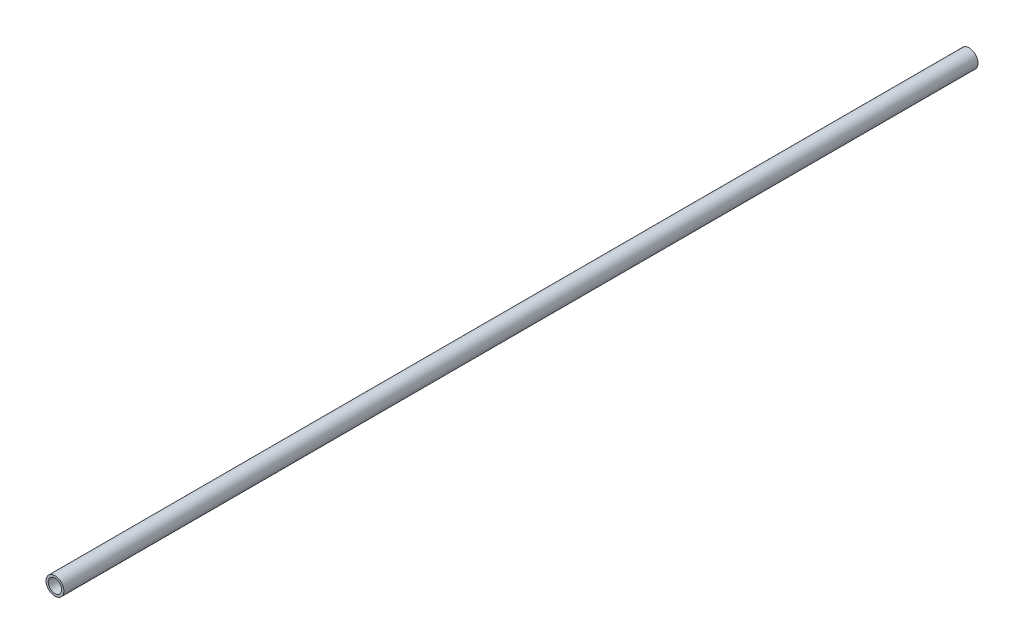
ISO-10303-21;
HEADER;
FILE_DESCRIPTION(('STEP AP214'),'2;1');
FILE_NAME('part.step','',(''),(''),'','','');
FILE_SCHEMA(('AUTOMOTIVE_DESIGN { 1 0 10303 214 1 1 1 1 }'));
ENDSEC;
DATA;
#1=APPLICATION_CONTEXT('core data for automotive mechanical design processes');
#2=APPLICATION_PROTOCOL_DEFINITION('international standard','automotive_design',2000,#1);
#3=PRODUCT_CONTEXT('',#1,'mechanical');
#4=PRODUCT('Part','Part','',(#3));
#5=PRODUCT_RELATED_PRODUCT_CATEGORY('part','',(#4));
#6=PRODUCT_DEFINITION_FORMATION('','',#4);
#7=PRODUCT_DEFINITION_CONTEXT('part definition',#1,'design');
#8=PRODUCT_DEFINITION('design','',#6,#7);
#9=PRODUCT_DEFINITION_SHAPE('','',#8);
#10=(LENGTH_UNIT() NAMED_UNIT(*) SI_UNIT(.MILLI.,.METRE.));
#11=(NAMED_UNIT(*) PLANE_ANGLE_UNIT() SI_UNIT($,.RADIAN.));
#12=(NAMED_UNIT(*) SI_UNIT($,.STERADIAN.) SOLID_ANGLE_UNIT());
#13=UNCERTAINTY_MEASURE_WITH_UNIT(LENGTH_MEASURE(1.E-05),#10,'distance_accuracy_value','');
#14=(GEOMETRIC_REPRESENTATION_CONTEXT(3) GLOBAL_UNCERTAINTY_ASSIGNED_CONTEXT((#13)) GLOBAL_UNIT_ASSIGNED_CONTEXT((#10,
#11,#12)) REPRESENTATION_CONTEXT('',''));
#15=CARTESIAN_POINT('',(0.,0.,0.));
#16=DIRECTION('',(0.,0.,1.));
#17=DIRECTION('',(1.,0.,0.));
#18=AXIS2_PLACEMENT_3D('',#15,#16,#17);
#19=CARTESIAN_POINT('',(0.753770008918936,0.,205.));
#20=DIRECTION('',(0.,0.,1.));
#21=DIRECTION('',(1.,0.,0.));
#22=AXIS2_PLACEMENT_3D('',#19,#20,#21);
#23=PLANE('',#22);
#24=CARTESIAN_POINT('',(0.753770008918936,0.,205.));
#25=DIRECTION('',(0.,0.,1.));
#26=DIRECTION('',(1.,0.,0.));
#27=AXIS2_PLACEMENT_3D('',#24,#25,#26);
#28=CIRCLE('',#27,2.);
#29=CARTESIAN_POINT('',(-1.24622999108107,0.,205.));
#30=VERTEX_POINT('',#29);
#31=EDGE_CURVE('E11',#30,#30,#28,.T.);
#32=ORIENTED_EDGE('',*,*,#31,.T.);
#33=EDGE_LOOP('',(#32));
#34=FACE_BOUND('',#33,.T.);
#35=CARTESIAN_POINT('',(0.753770008918936,0.,205.));
#36=DIRECTION('',(0.,0.,1.));
#37=DIRECTION('',(1.,0.,0.));
#38=AXIS2_PLACEMENT_3D('',#35,#36,#37);
#39=CIRCLE('',#38,1.5);
#40=CARTESIAN_POINT('',(-0.746229991081066,0.,205.));
#41=VERTEX_POINT('',#40);
#42=EDGE_CURVE('E50',#41,#41,#39,.T.);
#43=ORIENTED_EDGE('',*,*,#42,.F.);
#44=EDGE_LOOP('',(#43));
#45=FACE_BOUND('',#44,.T.);
#46=ADVANCED_FACE('F39',(#34,#45),#23,.T.);
#47=CARTESIAN_POINT('',(0.753770008918936,0.,0.));
#48=DIRECTION('',(0.,0.,1.));
#49=DIRECTION('',(1.,0.,0.));
#50=AXIS2_PLACEMENT_3D('',#47,#48,#49);
#51=PLANE('',#50);
#52=CARTESIAN_POINT('',(0.753770008918936,0.,0.));
#53=DIRECTION('',(0.,0.,1.));
#54=DIRECTION('',(1.,0.,0.));
#55=AXIS2_PLACEMENT_3D('',#52,#53,#54);
#56=CIRCLE('',#55,2.);
#57=CARTESIAN_POINT('',(-1.24622999108107,0.,0.));
#58=VERTEX_POINT('',#57);
#59=EDGE_CURVE('E43',#58,#58,#56,.T.);
#60=ORIENTED_EDGE('',*,*,#59,.F.);
#61=EDGE_LOOP('',(#60));
#62=FACE_BOUND('',#61,.T.);
#63=CARTESIAN_POINT('',(0.753770008918936,0.,0.));
#64=DIRECTION('',(0.,0.,1.));
#65=DIRECTION('',(1.,0.,0.));
#66=AXIS2_PLACEMENT_3D('',#63,#64,#65);
#67=CIRCLE('',#66,1.5);
#68=CARTESIAN_POINT('',(-0.746229991081066,0.,0.));
#69=VERTEX_POINT('',#68);
#70=EDGE_CURVE('E52',#69,#69,#67,.T.);
#71=ORIENTED_EDGE('',*,*,#70,.T.);
#72=EDGE_LOOP('',(#71));
#73=FACE_BOUND('',#72,.T.);
#74=ADVANCED_FACE('F62',(#62,#73),#51,.F.);
#75=CARTESIAN_POINT('',(0.753770008918936,0.,205.));
#76=DIRECTION('',(0.,0.,-1.));
#77=DIRECTION('',(-1.,0.,0.));
#78=AXIS2_PLACEMENT_3D('',#75,#76,#77);
#79=CYLINDRICAL_SURFACE('',#78,2.);
#80=CARTESIAN_POINT('',(-1.24622999108107,0.,205.));
#81=CARTESIAN_POINT('',(-1.24622999108107,0.,202.864583333333));
#82=CARTESIAN_POINT('',(-1.24622999108107,0.,200.729166666667));
#83=CARTESIAN_POINT('',(-1.24622999108107,0.,196.458333333333));
#84=CARTESIAN_POINT('',(-1.24622999108107,0.,194.322916666667));
#85=CARTESIAN_POINT('',(-1.24622999108107,0.,190.052083333333));
#86=CARTESIAN_POINT('',(-1.24622999108107,0.,187.916666666667));
#87=CARTESIAN_POINT('',(-1.24622999108107,0.,183.645833333333));
#88=CARTESIAN_POINT('',(-1.24622999108107,0.,181.510416666667));
#89=CARTESIAN_POINT('',(-1.24622999108107,0.,177.239583333333));
#90=CARTESIAN_POINT('',(-1.24622999108107,0.,175.104166666667));
#91=CARTESIAN_POINT('',(-1.24622999108107,0.,170.833333333333));
#92=CARTESIAN_POINT('',(-1.24622999108107,0.,168.697916666667));
#93=CARTESIAN_POINT('',(-1.24622999108107,0.,164.427083333333));
#94=CARTESIAN_POINT('',(-1.24622999108107,0.,162.291666666667));
#95=CARTESIAN_POINT('',(-1.24622999108107,0.,158.020833333333));
#96=CARTESIAN_POINT('',(-1.24622999108107,0.,155.885416666667));
#97=CARTESIAN_POINT('',(-1.24622999108107,0.,151.614583333333));
#98=CARTESIAN_POINT('',(-1.24622999108107,0.,149.479166666667));
#99=CARTESIAN_POINT('',(-1.24622999108107,0.,145.208333333333));
#100=CARTESIAN_POINT('',(-1.24622999108107,0.,143.072916666667));
#101=CARTESIAN_POINT('',(-1.24622999108107,0.,138.802083333333));
#102=CARTESIAN_POINT('',(-1.24622999108107,0.,136.666666666667));
#103=CARTESIAN_POINT('',(-1.24622999108107,0.,132.395833333333));
#104=CARTESIAN_POINT('',(-1.24622999108107,0.,130.260416666667));
#105=CARTESIAN_POINT('',(-1.24622999108107,0.,125.989583333333));
#106=CARTESIAN_POINT('',(-1.24622999108107,0.,123.854166666667));
#107=CARTESIAN_POINT('',(-1.24622999108107,0.,119.583333333333));
#108=CARTESIAN_POINT('',(-1.24622999108107,0.,117.447916666667));
#109=CARTESIAN_POINT('',(-1.24622999108107,0.,113.177083333333));
#110=CARTESIAN_POINT('',(-1.24622999108107,0.,111.041666666667));
#111=CARTESIAN_POINT('',(-1.24622999108107,0.,106.770833333333));
#112=CARTESIAN_POINT('',(-1.24622999108107,0.,104.635416666667));
#113=CARTESIAN_POINT('',(-1.24622999108107,0.,100.364583333333));
#114=CARTESIAN_POINT('',(-1.24622999108107,0.,98.2291666666666));
#115=CARTESIAN_POINT('',(-1.24622999108107,0.,93.9583333333333));
#116=CARTESIAN_POINT('',(-1.24622999108107,0.,91.8229166666666));
#117=CARTESIAN_POINT('',(-1.24622999108107,0.,87.5520833333333));
#118=CARTESIAN_POINT('',(-1.24622999108107,0.,85.4166666666666));
#119=CARTESIAN_POINT('',(-1.24622999108107,0.,81.1458333333333));
#120=CARTESIAN_POINT('',(-1.24622999108107,0.,79.0104166666667));
#121=CARTESIAN_POINT('',(-1.24622999108107,0.,74.7395833333333));
#122=CARTESIAN_POINT('',(-1.24622999108107,0.,72.6041666666667));
#123=CARTESIAN_POINT('',(-1.24622999108107,0.,68.3333333333333));
#124=CARTESIAN_POINT('',(-1.24622999108107,0.,66.1979166666667));
#125=CARTESIAN_POINT('',(-1.24622999108107,0.,61.9270833333333));
#126=CARTESIAN_POINT('',(-1.24622999108107,0.,59.7916666666667));
#127=CARTESIAN_POINT('',(-1.24622999108107,0.,55.5208333333333));
#128=CARTESIAN_POINT('',(-1.24622999108107,0.,53.3854166666667));
#129=CARTESIAN_POINT('',(-1.24622999108107,0.,49.1145833333333));
#130=CARTESIAN_POINT('',(-1.24622999108107,0.,46.9791666666667));
#131=CARTESIAN_POINT('',(-1.24622999108107,0.,42.7083333333333));
#132=CARTESIAN_POINT('',(-1.24622999108107,0.,40.5729166666667));
#133=CARTESIAN_POINT('',(-1.24622999108107,0.,36.3020833333333));
#134=CARTESIAN_POINT('',(-1.24622999108107,0.,34.1666666666667));
#135=CARTESIAN_POINT('',(-1.24622999108107,0.,29.8958333333333));
#136=CARTESIAN_POINT('',(-1.24622999108107,0.,27.7604166666667));
#137=CARTESIAN_POINT('',(-1.24622999108107,0.,23.4895833333333));
#138=CARTESIAN_POINT('',(-1.24622999108107,0.,21.3541666666667));
#139=CARTESIAN_POINT('',(-1.24622999108107,0.,17.0833333333333));
#140=CARTESIAN_POINT('',(-1.24622999108107,0.,14.9479166666667));
#141=CARTESIAN_POINT('',(-1.24622999108107,0.,10.6770833333333));
#142=CARTESIAN_POINT('',(-1.24622999108107,0.,8.54166666666667));
#143=CARTESIAN_POINT('',(-1.24622999108107,0.,4.27083333333333));
#144=CARTESIAN_POINT('',(-1.24622999108107,0.,2.13541666666667));
#145=CARTESIAN_POINT('',(-1.24622999108107,0.,0.));
#146=B_SPLINE_CURVE_WITH_KNOTS('',3,(#80,#81,#82,#83,#84,#85,#86,#87,#88,#89,#90,#91,#92,#93,
#94,#95,#96,#97,#98,#99,#100,#101,#102,#103,#104,#105,#106,#107,#108,#109,#110,#111,#112,#113,
#114,#115,#116,#117,#118,#119,#120,#121,#122,#123,#124,#125,#126,#127,#128,#129,#130,#131,#132,
#133,#134,#135,#136,#137,#138,#139,#140,#141,#142,#143,#144,#145),.UNSPECIFIED.,.F.,.F.,(4,2,2,
2,2,2,2,2,2,2,2,2,2,2,2,2,2,2,2,2,2,2,2,2,2,2,2,2,2,2,2,2,4),(0.,6.40625,12.8125,19.21875,
25.625,32.03125,38.4375,44.84375,51.25,57.65625,64.0625,70.46875,76.875,83.28125,89.6875,
96.09375,102.5,108.90625,115.3125,121.71875,128.125,134.53125,140.9375,147.34375,153.75,
160.15625,166.5625,172.96875,179.375,185.78125,192.1875,198.59375,205.),.UNSPECIFIED.);
#147=EDGE_CURVE('BSEAM41',#30,#58,#146,.T.);
#148=ORIENTED_EDGE('',*,*,#31,.F.);
#149=ORIENTED_EDGE('',*,*,#59,.T.);
#150=ORIENTED_EDGE('',*,*,#147,.T.);
#151=ORIENTED_EDGE('',*,*,#147,.F.);
#152=EDGE_LOOP('',(#148,#150,#149,#151));
#153=FACE_BOUND('',#152,.T.);
#154=ADVANCED_FACE('F41',(#153),#79,.T.);
#155=CARTESIAN_POINT('',(0.753770008918936,0.,205.));
#156=DIRECTION('',(0.,0.,-1.));
#157=DIRECTION('',(-1.,0.,0.));
#158=AXIS2_PLACEMENT_3D('',#155,#156,#157);
#159=CYLINDRICAL_SURFACE('',#158,1.5);
#160=CARTESIAN_POINT('',(-0.746229991081066,0.,205.));
#161=CARTESIAN_POINT('',(-0.746229991081066,0.,202.864583333333));
#162=CARTESIAN_POINT('',(-0.746229991081066,0.,200.729166666667));
#163=CARTESIAN_POINT('',(-0.746229991081066,0.,196.458333333333));
#164=CARTESIAN_POINT('',(-0.746229991081066,0.,194.322916666667));
#165=CARTESIAN_POINT('',(-0.746229991081066,0.,190.052083333333));
#166=CARTESIAN_POINT('',(-0.746229991081066,0.,187.916666666667));
#167=CARTESIAN_POINT('',(-0.746229991081066,0.,183.645833333333));
#168=CARTESIAN_POINT('',(-0.746229991081066,0.,181.510416666667));
#169=CARTESIAN_POINT('',(-0.746229991081066,0.,177.239583333333));
#170=CARTESIAN_POINT('',(-0.746229991081066,0.,175.104166666667));
#171=CARTESIAN_POINT('',(-0.746229991081066,0.,170.833333333333));
#172=CARTESIAN_POINT('',(-0.746229991081066,0.,168.697916666667));
#173=CARTESIAN_POINT('',(-0.746229991081066,0.,164.427083333333));
#174=CARTESIAN_POINT('',(-0.746229991081066,0.,162.291666666667));
#175=CARTESIAN_POINT('',(-0.746229991081066,0.,158.020833333333));
#176=CARTESIAN_POINT('',(-0.746229991081066,0.,155.885416666667));
#177=CARTESIAN_POINT('',(-0.746229991081066,0.,151.614583333333));
#178=CARTESIAN_POINT('',(-0.746229991081066,0.,149.479166666667));
#179=CARTESIAN_POINT('',(-0.746229991081066,0.,145.208333333333));
#180=CARTESIAN_POINT('',(-0.746229991081066,0.,143.072916666667));
#181=CARTESIAN_POINT('',(-0.746229991081066,0.,138.802083333333));
#182=CARTESIAN_POINT('',(-0.746229991081066,0.,136.666666666667));
#183=CARTESIAN_POINT('',(-0.746229991081066,0.,132.395833333333));
#184=CARTESIAN_POINT('',(-0.746229991081066,0.,130.260416666667));
#185=CARTESIAN_POINT('',(-0.746229991081066,0.,125.989583333333));
#186=CARTESIAN_POINT('',(-0.746229991081066,0.,123.854166666667));
#187=CARTESIAN_POINT('',(-0.746229991081066,0.,119.583333333333));
#188=CARTESIAN_POINT('',(-0.746229991081066,0.,117.447916666667));
#189=CARTESIAN_POINT('',(-0.746229991081066,0.,113.177083333333));
#190=CARTESIAN_POINT('',(-0.746229991081066,0.,111.041666666667));
#191=CARTESIAN_POINT('',(-0.746229991081066,0.,106.770833333333));
#192=CARTESIAN_POINT('',(-0.746229991081066,0.,104.635416666667));
#193=CARTESIAN_POINT('',(-0.746229991081066,0.,100.364583333333));
#194=CARTESIAN_POINT('',(-0.746229991081066,0.,98.2291666666667));
#195=CARTESIAN_POINT('',(-0.746229991081066,0.,93.9583333333333));
#196=CARTESIAN_POINT('',(-0.746229991081066,0.,91.8229166666667));
#197=CARTESIAN_POINT('',(-0.746229991081066,0.,87.5520833333333));
#198=CARTESIAN_POINT('',(-0.746229991081066,0.,85.4166666666667));
#199=CARTESIAN_POINT('',(-0.746229991081066,0.,81.1458333333333));
#200=CARTESIAN_POINT('',(-0.746229991081066,0.,79.0104166666667));
#201=CARTESIAN_POINT('',(-0.746229991081066,0.,74.7395833333333));
#202=CARTESIAN_POINT('',(-0.746229991081066,0.,72.6041666666667));
#203=CARTESIAN_POINT('',(-0.746229991081066,0.,68.3333333333333));
#204=CARTESIAN_POINT('',(-0.746229991081066,0.,66.1979166666667));
#205=CARTESIAN_POINT('',(-0.746229991081066,0.,61.9270833333333));
#206=CARTESIAN_POINT('',(-0.746229991081066,0.,59.7916666666667));
#207=CARTESIAN_POINT('',(-0.746229991081066,0.,55.5208333333333));
#208=CARTESIAN_POINT('',(-0.746229991081066,0.,53.3854166666667));
#209=CARTESIAN_POINT('',(-0.746229991081066,0.,49.1145833333333));
#210=CARTESIAN_POINT('',(-0.746229991081066,0.,46.9791666666667));
#211=CARTESIAN_POINT('',(-0.746229991081066,0.,42.7083333333333));
#212=CARTESIAN_POINT('',(-0.746229991081066,0.,40.5729166666667));
#213=CARTESIAN_POINT('',(-0.746229991081066,0.,36.3020833333333));
#214=CARTESIAN_POINT('',(-0.746229991081066,0.,34.1666666666667));
#215=CARTESIAN_POINT('',(-0.746229991081066,0.,29.8958333333333));
#216=CARTESIAN_POINT('',(-0.746229991081066,0.,27.7604166666667));
#217=CARTESIAN_POINT('',(-0.746229991081066,0.,23.4895833333333));
#218=CARTESIAN_POINT('',(-0.746229991081066,0.,21.3541666666667));
#219=CARTESIAN_POINT('',(-0.746229991081066,0.,17.0833333333333));
#220=CARTESIAN_POINT('',(-0.746229991081066,0.,14.9479166666667));
#221=CARTESIAN_POINT('',(-0.746229991081066,0.,10.6770833333333));
#222=CARTESIAN_POINT('',(-0.746229991081066,0.,8.54166666666667));
#223=CARTESIAN_POINT('',(-0.746229991081066,0.,4.27083333333333));
#224=CARTESIAN_POINT('',(-0.746229991081066,0.,2.13541666666667));
#225=CARTESIAN_POINT('',(-0.746229991081066,0.,0.));
#226=B_SPLINE_CURVE_WITH_KNOTS('',3,(#160,#161,#162,#163,#164,#165,#166,#167,#168,#169,#170,
#171,#172,#173,#174,#175,#176,#177,#178,#179,#180,#181,#182,#183,#184,#185,#186,#187,#188,#189,
#190,#191,#192,#193,#194,#195,#196,#197,#198,#199,#200,#201,#202,#203,#204,#205,#206,#207,#208,
#209,#210,#211,#212,#213,#214,#215,#216,#217,#218,#219,#220,#221,#222,#223,#224,#225),
.UNSPECIFIED.,.F.,.F.,(4,2,2,2,2,2,2,2,2,2,2,2,2,2,2,2,2,2,2,2,2,2,2,2,2,2,2,2,2,2,2,2,4),(0.,
6.40624999999997,12.8125,19.21875,25.625,32.03125,38.4375,44.84375,51.25,57.65625,64.0625,
70.46875,76.875,83.28125,89.6875,96.09375,102.5,108.90625,115.3125,121.71875,128.125,134.53125,
140.9375,147.34375,153.75,160.15625,166.5625,172.96875,179.375,185.78125,192.1875,198.59375,
205.),.UNSPECIFIED.);
#227=EDGE_CURVE('BSEAM58',#41,#69,#226,.T.);
#228=ORIENTED_EDGE('',*,*,#42,.T.);
#229=ORIENTED_EDGE('',*,*,#70,.F.);
#230=ORIENTED_EDGE('',*,*,#227,.T.);
#231=ORIENTED_EDGE('',*,*,#227,.F.);
#232=EDGE_LOOP('',(#228,#230,#229,#231));
#233=FACE_BOUND('',#232,.T.);
#234=ADVANCED_FACE('F58',(#233),#159,.F.);
#235=CLOSED_SHELL('',(#46,#74,#154,#234));
#236=MANIFOLD_SOLID_BREP('B2',#235);
#237=ADVANCED_BREP_SHAPE_REPRESENTATION('',(#18,#236),#14);
#238=SHAPE_DEFINITION_REPRESENTATION(#9,#237);
ENDSEC;
END-ISO-10303-21;
